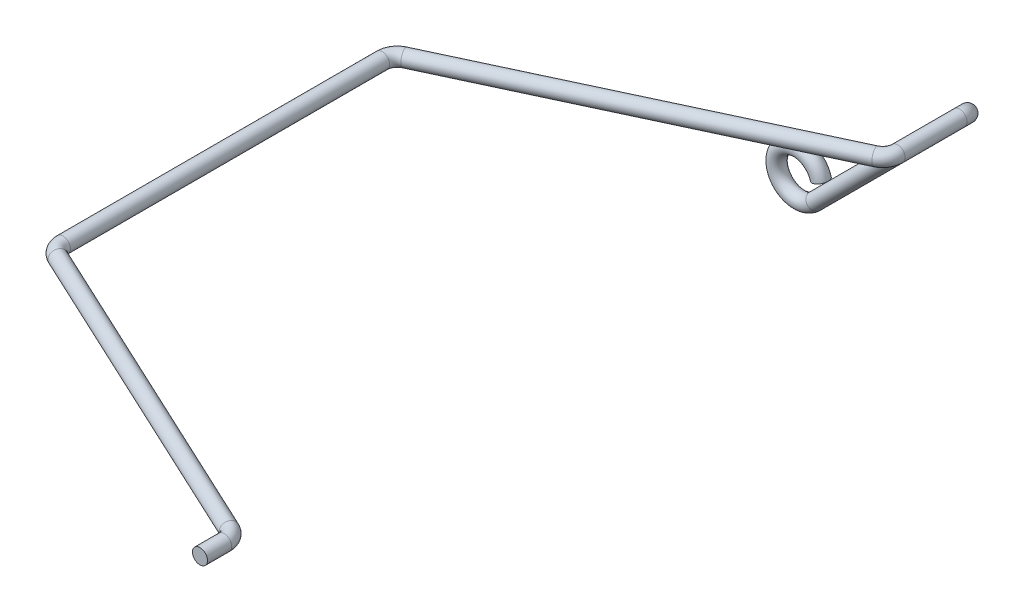
ISO-10303-21;
HEADER;
FILE_DESCRIPTION(('STEP AP214'),'2;1');
FILE_NAME('part.step','',(''),(''),'','','');
FILE_SCHEMA(('AUTOMOTIVE_DESIGN { 1 0 10303 214 1 1 1 1 }'));
ENDSEC;
DATA;
#1=APPLICATION_CONTEXT('core data for automotive mechanical design processes');
#2=APPLICATION_PROTOCOL_DEFINITION('international standard','automotive_design',2000,#1);
#3=PRODUCT_CONTEXT('',#1,'mechanical');
#4=PRODUCT('Part','Part','',(#3));
#5=PRODUCT_RELATED_PRODUCT_CATEGORY('part','',(#4));
#6=PRODUCT_DEFINITION_FORMATION('','',#4);
#7=PRODUCT_DEFINITION_CONTEXT('part definition',#1,'design');
#8=PRODUCT_DEFINITION('design','',#6,#7);
#9=PRODUCT_DEFINITION_SHAPE('','',#8);
#10=(LENGTH_UNIT() NAMED_UNIT(*) SI_UNIT(.MILLI.,.METRE.));
#11=(NAMED_UNIT(*) PLANE_ANGLE_UNIT() SI_UNIT($,.RADIAN.));
#12=(NAMED_UNIT(*) SI_UNIT($,.STERADIAN.) SOLID_ANGLE_UNIT());
#13=UNCERTAINTY_MEASURE_WITH_UNIT(LENGTH_MEASURE(1.E-05),#10,'distance_accuracy_value','');
#14=(GEOMETRIC_REPRESENTATION_CONTEXT(3) GLOBAL_UNCERTAINTY_ASSIGNED_CONTEXT((#13)) GLOBAL_UNIT_ASSIGNED_CONTEXT((#10,
#11,#12)) REPRESENTATION_CONTEXT('',''));
#15=CARTESIAN_POINT('',(0.,0.,0.));
#16=DIRECTION('',(0.,0.,1.));
#17=DIRECTION('',(1.,0.,0.));
#18=AXIS2_PLACEMENT_3D('',#15,#16,#17);
#19=CARTESIAN_POINT('',(-23.334523779156,-19.0918830920372,-103.));
#20=DIRECTION('',(0.,0.,1.));
#21=DIRECTION('',(-1.,0.,0.));
#22=AXIS2_PLACEMENT_3D('',#19,#20,#21);
#23=TOROIDAL_SURFACE('',#22,2.9999999999999,1.);
#24=CARTESIAN_POINT('',(-20.436746300289,-18.3154259567292,-103.));
#25=DIRECTION('',(-0.258819045102662,0.96592582628903,0.));
#26=DIRECTION('',(0.683012701892195,0.183012701892317,-0.707106781186546));
#27=AXIS2_PLACEMENT_3D('',#24,#25,#26);
#28=CIRCLE('',#27,1.);
#29=CARTESIAN_POINT('',(-19.470820474,-18.0566069116266,-103.));
#30=VERTEX_POINT('',#29);
#31=EDGE_CURVE('E10',#30,#30,#28,.T.);
#32=CARTESIAN_POINT('',(-21.2132034355965,-21.2132034355968,-103.));
#33=DIRECTION('',(0.707106781186561,0.707106781186534,0.));
#34=DIRECTION('',(0.49999999999999,-0.500000000000013,-0.707106781186546));
#35=AXIS2_PLACEMENT_3D('',#32,#33,#34);
#36=CIRCLE('',#35,1.);
#37=CARTESIAN_POINT('',(-20.50609665441,-21.9203102167833,-103.));
#38=VERTEX_POINT('',#37);
#39=EDGE_CURVE('E39',#38,#38,#36,.T.);
#40=CARTESIAN_POINT('',(-23.334523779156,-19.0918830920372,-103.));
#41=DIRECTION('',(0.,0.,1.));
#42=DIRECTION('',(-1.,0.,0.));
#43=AXIS2_PLACEMENT_3D('',#40,#41,#42);
#44=CIRCLE('',#43,3.9999999999999);
#45=EDGE_CURVE('',#30,#38,#44,.T.);
#46=ORIENTED_EDGE('',*,*,#31,.T.);
#47=ORIENTED_EDGE('',*,*,#39,.F.);
#48=ORIENTED_EDGE('',*,*,#45,.T.);
#49=ORIENTED_EDGE('',*,*,#45,.F.);
#50=EDGE_LOOP('',(#46,#48,#47,#49));
#51=FACE_BOUND('',#50,.T.);
#52=ADVANCED_FACE('F33',(#51),#23,.T.);
#53=CARTESIAN_POINT('',(-1.41421356237319,-1.41421356237305,-103.));
#54=DIRECTION('',(-0.70710678118654,-0.707106781186555,0.));
#55=DIRECTION('',(0.707106781186555,-0.70710678118654,0.));
#56=AXIS2_PLACEMENT_3D('',#53,#54,#55);
#57=CYLINDRICAL_SURFACE('',#56,1.);
#58=CARTESIAN_POINT('',(-1.41421356237319,-1.41421356237305,-103.));
#59=DIRECTION('',(0.707106781186561,0.707106781186534,0.));
#60=DIRECTION('',(0.49999999999999,-0.500000000000013,-0.707106781186546));
#61=AXIS2_PLACEMENT_3D('',#58,#59,#60);
#62=CIRCLE('',#61,1.);
#63=CARTESIAN_POINT('',(-1.41421356237319,-1.41421356237307,-104.));
#64=VERTEX_POINT('',#63);
#65=EDGE_CURVE('E43',#64,#64,#62,.T.);
#66=ORIENTED_EDGE('',*,*,#65,.F.);
#67=EDGE_LOOP('',(#66));
#68=FACE_BOUND('',#67,.T.);
#69=ORIENTED_EDGE('',*,*,#39,.T.);
#70=EDGE_LOOP('',(#69));
#71=FACE_BOUND('',#70,.T.);
#72=ADVANCED_FACE('F134',(#68,#71),#57,.T.);
#73=CARTESIAN_POINT('',(-1.41421356237318,-1.41421356237301,-101.));
#74=DIRECTION('',(0.707106781186544,-0.707106781186551,0.));
#75=DIRECTION('',(0.707106781186551,0.707106781186544,0.));
#76=AXIS2_PLACEMENT_3D('',#73,#74,#75);
#77=TOROIDAL_SURFACE('',#76,2.00000000000012,1.);
#78=CARTESIAN_POINT('',(0.,1.63658069083023E-13,-101.));
#79=DIRECTION('',(0.,0.,1.));
#80=DIRECTION('',(1.,0.,0.));
#81=AXIS2_PLACEMENT_3D('',#78,#79,#80);
#82=CIRCLE('',#81,1.);
#83=CARTESIAN_POINT('',(0.707106781186553,0.707106781186707,-101.));
#84=VERTEX_POINT('',#83);
#85=EDGE_CURVE('E47',#84,#84,#82,.T.);
#86=CARTESIAN_POINT('',(-1.41421356237318,-1.41421356237301,-101.));
#87=DIRECTION('',(0.707106781186544,-0.707106781186551,0.));
#88=DIRECTION('',(0.707106781186551,0.707106781186544,0.));
#89=AXIS2_PLACEMENT_3D('',#86,#87,#88);
#90=CIRCLE('',#89,3.00000000000012);
#91=EDGE_CURVE('',#64,#84,#90,.T.);
#92=ORIENTED_EDGE('',*,*,#65,.T.);
#93=ORIENTED_EDGE('',*,*,#85,.F.);
#94=ORIENTED_EDGE('',*,*,#91,.T.);
#95=ORIENTED_EDGE('',*,*,#91,.F.);
#96=EDGE_LOOP('',(#92,#94,#93,#95));
#97=FACE_BOUND('',#96,.T.);
#98=ADVANCED_FACE('F128',(#97),#77,.T.);
#99=CARTESIAN_POINT('',(0.,0.,-92.7737260476329));
#100=DIRECTION('',(0.,0.,-1.));
#101=DIRECTION('',(0.,-1.,0.));
#102=AXIS2_PLACEMENT_3D('',#99,#100,#101);
#103=CYLINDRICAL_SURFACE('',#102,1.);
#104=CARTESIAN_POINT('',(0.,0.,-92.7737260476329));
#105=DIRECTION('',(0.,0.,1.));
#106=DIRECTION('',(1.,0.,0.));
#107=AXIS2_PLACEMENT_3D('',#104,#105,#106);
#108=CIRCLE('',#107,1.);
#109=CARTESIAN_POINT('',(1.,0.,-92.7737260476329));
#110=VERTEX_POINT('',#109);
#111=EDGE_CURVE('E52',#110,#110,#108,.T.);
#112=ORIENTED_EDGE('',*,*,#111,.F.);
#113=EDGE_LOOP('',(#112));
#114=FACE_BOUND('',#113,.T.);
#115=ORIENTED_EDGE('',*,*,#85,.T.);
#116=EDGE_LOOP('',(#115));
#117=FACE_BOUND('',#116,.T.);
#118=ADVANCED_FACE('F122',(#114,#117),#103,.T.);
#119=CARTESIAN_POINT('',(-2.,0.,-92.7737260476329));
#120=DIRECTION('',(0.,-1.,0.));
#121=DIRECTION('',(0.,0.,1.));
#122=AXIS2_PLACEMENT_3D('',#119,#120,#121);
#123=TOROIDAL_SURFACE('',#122,2.,1.);
#124=CARTESIAN_POINT('',(-1.15422906933774,0.,-90.9613597676424));
#125=DIRECTION('',(-0.906183139995262,0.,0.422885465331132));
#126=DIRECTION('',(0.422885465331132,0.,0.906183139995262));
#127=AXIS2_PLACEMENT_3D('',#124,#125,#126);
#128=CIRCLE('',#127,1.);
#129=CARTESIAN_POINT('',(-0.731343604006615,0.,-90.0551766276471));
#130=VERTEX_POINT('',#129);
#131=EDGE_CURVE('E55',#130,#130,#128,.T.);
#132=CARTESIAN_POINT('',(-2.,0.,-92.7737260476329));
#133=DIRECTION('',(0.,-1.,0.));
#134=DIRECTION('',(0.,0.,1.));
#135=AXIS2_PLACEMENT_3D('',#132,#133,#134);
#136=CIRCLE('',#135,3.);
#137=EDGE_CURVE('',#110,#130,#136,.T.);
#138=ORIENTED_EDGE('',*,*,#111,.T.);
#139=ORIENTED_EDGE('',*,*,#131,.F.);
#140=ORIENTED_EDGE('',*,*,#137,.T.);
#141=ORIENTED_EDGE('',*,*,#137,.F.);
#142=EDGE_LOOP('',(#138,#140,#139,#141));
#143=FACE_BOUND('',#142,.T.);
#144=ADVANCED_FACE('F116',(#143),#123,.T.);
#145=CARTESIAN_POINT('',(-43.8457709306622,0.,-71.0386402323576));
#146=DIRECTION('',(0.906183139995265,0.,-0.422885465331124));
#147=DIRECTION('',(0.422885465331124,0.,0.906183139995265));
#148=AXIS2_PLACEMENT_3D('',#145,#146,#147);
#149=CYLINDRICAL_SURFACE('',#148,1.);
#150=CARTESIAN_POINT('',(-43.8457709306622,0.,-71.0386402323576));
#151=DIRECTION('',(-0.906183139995262,0.,0.422885465331132));
#152=DIRECTION('',(0.422885465331132,0.,0.906183139995262));
#153=AXIS2_PLACEMENT_3D('',#150,#151,#152);
#154=CIRCLE('',#153,1.);
#155=CARTESIAN_POINT('',(-44.2686563959934,0.,-71.9448233723529));
#156=VERTEX_POINT('',#155);
#157=EDGE_CURVE('E58',#156,#156,#154,.T.);
#158=ORIENTED_EDGE('',*,*,#157,.F.);
#159=EDGE_LOOP('',(#158));
#160=FACE_BOUND('',#159,.T.);
#161=ORIENTED_EDGE('',*,*,#131,.T.);
#162=EDGE_LOOP('',(#161));
#163=FACE_BOUND('',#162,.T.);
#164=ADVANCED_FACE('F110',(#160,#163),#149,.T.);
#165=CARTESIAN_POINT('',(-43.,0.,-69.2262739523671));
#166=DIRECTION('',(0.,1.,0.));
#167=DIRECTION('',(0.,0.,-1.));
#168=AXIS2_PLACEMENT_3D('',#165,#166,#167);
#169=TOROIDAL_SURFACE('',#168,2.00000000000001,1.);
#170=CARTESIAN_POINT('',(-45.,0.,-69.2262739523671));
#171=DIRECTION('',(0.,0.,1.));
#172=DIRECTION('',(1.,0.,0.));
#173=AXIS2_PLACEMENT_3D('',#170,#171,#172);
#174=CIRCLE('',#173,1.);
#175=CARTESIAN_POINT('',(-46.,0.,-69.2262739523671));
#176=VERTEX_POINT('',#175);
#177=EDGE_CURVE('E61',#176,#176,#174,.T.);
#178=CARTESIAN_POINT('',(-43.,0.,-69.2262739523671));
#179=DIRECTION('',(0.,1.,0.));
#180=DIRECTION('',(0.,0.,-1.));
#181=AXIS2_PLACEMENT_3D('',#178,#179,#180);
#182=CIRCLE('',#181,3.00000000000001);
#183=EDGE_CURVE('',#156,#176,#182,.T.);
#184=ORIENTED_EDGE('',*,*,#157,.T.);
#185=ORIENTED_EDGE('',*,*,#177,.F.);
#186=ORIENTED_EDGE('',*,*,#183,.T.);
#187=ORIENTED_EDGE('',*,*,#183,.F.);
#188=EDGE_LOOP('',(#184,#186,#185,#187));
#189=FACE_BOUND('',#188,.T.);
#190=ADVANCED_FACE('F104',(#189),#169,.T.);
#191=CARTESIAN_POINT('',(-45.,0.,-26.7737260476329));
#192=DIRECTION('',(0.,0.,-1.));
#193=DIRECTION('',(1.,0.,0.));
#194=AXIS2_PLACEMENT_3D('',#191,#192,#193);
#195=CYLINDRICAL_SURFACE('',#194,1.);
#196=CARTESIAN_POINT('',(-45.,0.,-26.7737260476329));
#197=DIRECTION('',(0.,0.,1.));
#198=DIRECTION('',(1.,0.,0.));
#199=AXIS2_PLACEMENT_3D('',#196,#197,#198);
#200=CIRCLE('',#199,1.);
#201=CARTESIAN_POINT('',(-46.,0.,-26.7737260476329));
#202=VERTEX_POINT('',#201);
#203=EDGE_CURVE('E64',#202,#202,#200,.T.);
#204=ORIENTED_EDGE('',*,*,#203,.F.);
#205=EDGE_LOOP('',(#204));
#206=FACE_BOUND('',#205,.T.);
#207=ORIENTED_EDGE('',*,*,#177,.T.);
#208=EDGE_LOOP('',(#207));
#209=FACE_BOUND('',#208,.T.);
#210=ADVANCED_FACE('F98',(#206,#209),#195,.T.);
#211=CARTESIAN_POINT('',(-43.,0.,-26.7737260476329));
#212=DIRECTION('',(0.,1.,0.));
#213=DIRECTION('',(0.,0.,-1.));
#214=AXIS2_PLACEMENT_3D('',#211,#212,#213);
#215=TOROIDAL_SURFACE('',#214,2.,1.);
#216=CARTESIAN_POINT('',(-43.8457709306623,0.,-24.9613597676424));
#217=DIRECTION('',(0.906183139995265,0.,0.422885465331124));
#218=DIRECTION('',(0.422885465331124,0.,-0.906183139995265));
#219=AXIS2_PLACEMENT_3D('',#216,#217,#218);
#220=CIRCLE('',#219,1.);
#221=CARTESIAN_POINT('',(-44.2686563959934,0.,-24.0551766276471));
#222=VERTEX_POINT('',#221);
#223=EDGE_CURVE('E67',#222,#222,#220,.T.);
#224=CARTESIAN_POINT('',(-43.,0.,-26.7737260476329));
#225=DIRECTION('',(0.,1.,0.));
#226=DIRECTION('',(0.,0.,-1.));
#227=AXIS2_PLACEMENT_3D('',#224,#225,#226);
#228=CIRCLE('',#227,3.);
#229=EDGE_CURVE('',#202,#222,#228,.T.);
#230=ORIENTED_EDGE('',*,*,#203,.T.);
#231=ORIENTED_EDGE('',*,*,#223,.F.);
#232=ORIENTED_EDGE('',*,*,#229,.T.);
#233=ORIENTED_EDGE('',*,*,#229,.F.);
#234=EDGE_LOOP('',(#230,#232,#231,#233));
#235=FACE_BOUND('',#234,.T.);
#236=ADVANCED_FACE('F92',(#235),#215,.T.);
#237=CARTESIAN_POINT('',(-1.15422906933775,0.,-5.03864023235763));
#238=DIRECTION('',(-0.906183139995266,0.,-0.422885465331124));
#239=DIRECTION('',(0.422885465331124,0.,-0.906183139995266));
#240=AXIS2_PLACEMENT_3D('',#237,#238,#239);
#241=CYLINDRICAL_SURFACE('',#240,1.);
#242=CARTESIAN_POINT('',(-1.15422906933775,0.,-5.03864023235763));
#243=DIRECTION('',(0.906183139995265,0.,0.422885465331124));
#244=DIRECTION('',(0.422885465331124,0.,-0.906183139995265));
#245=AXIS2_PLACEMENT_3D('',#242,#243,#244);
#246=CIRCLE('',#245,1.);
#247=CARTESIAN_POINT('',(-0.731343604006628,0.,-5.9448233723529));
#248=VERTEX_POINT('',#247);
#249=EDGE_CURVE('E70',#248,#248,#246,.T.);
#250=ORIENTED_EDGE('',*,*,#249,.F.);
#251=EDGE_LOOP('',(#250));
#252=FACE_BOUND('',#251,.T.);
#253=ORIENTED_EDGE('',*,*,#223,.T.);
#254=EDGE_LOOP('',(#253));
#255=FACE_BOUND('',#254,.T.);
#256=ADVANCED_FACE('F86',(#252,#255),#241,.T.);
#257=CARTESIAN_POINT('',(-2.,0.,-3.2262739523671));
#258=DIRECTION('',(0.,-1.,0.));
#259=DIRECTION('',(0.,0.,1.));
#260=AXIS2_PLACEMENT_3D('',#257,#258,#259);
#261=TOROIDAL_SURFACE('',#260,2.,1.);
#262=CARTESIAN_POINT('',(0.,0.,-3.2262739523671));
#263=DIRECTION('',(0.,0.,1.));
#264=DIRECTION('',(1.,0.,0.));
#265=AXIS2_PLACEMENT_3D('',#262,#263,#264);
#266=CIRCLE('',#265,1.);
#267=CARTESIAN_POINT('',(1.,0.,-3.2262739523671));
#268=VERTEX_POINT('',#267);
#269=EDGE_CURVE('E73',#268,#268,#266,.T.);
#270=CARTESIAN_POINT('',(-2.,0.,-3.2262739523671));
#271=DIRECTION('',(0.,-1.,0.));
#272=DIRECTION('',(0.,0.,1.));
#273=AXIS2_PLACEMENT_3D('',#270,#271,#272);
#274=CIRCLE('',#273,3.);
#275=EDGE_CURVE('',#248,#268,#274,.T.);
#276=ORIENTED_EDGE('',*,*,#249,.T.);
#277=ORIENTED_EDGE('',*,*,#269,.F.);
#278=ORIENTED_EDGE('',*,*,#275,.T.);
#279=ORIENTED_EDGE('',*,*,#275,.F.);
#280=EDGE_LOOP('',(#276,#278,#277,#279));
#281=FACE_BOUND('',#280,.T.);
#282=ADVANCED_FACE('F83',(#281),#261,.T.);
#283=CARTESIAN_POINT('',(0.,0.,-3.2262739523671));
#284=DIRECTION('',(0.,0.,1.));
#285=DIRECTION('',(0.,1.,0.));
#286=AXIS2_PLACEMENT_3D('',#283,#284,#285);
#287=CYLINDRICAL_SURFACE('',#286,1.);
#288=ORIENTED_EDGE('',*,*,#269,.T.);
#289=EDGE_LOOP('',(#288));
#290=FACE_BOUND('',#289,.T.);
#291=CARTESIAN_POINT('',(0.,0.,0.));
#292=DIRECTION('',(0.,0.,1.));
#293=DIRECTION('',(1.,0.,0.));
#294=AXIS2_PLACEMENT_3D('',#291,#292,#293);
#295=CIRCLE('',#294,1.);
#296=CARTESIAN_POINT('',(1.,0.,0.));
#297=VERTEX_POINT('',#296);
#298=EDGE_CURVE('E74',#297,#297,#295,.T.);
#299=ORIENTED_EDGE('',*,*,#298,.F.);
#300=EDGE_LOOP('',(#299));
#301=FACE_BOUND('',#300,.T.);
#302=ADVANCED_FACE('F80',(#290,#301),#287,.T.);
#303=CARTESIAN_POINT('',(-20.436746300289,-18.3154259567292,-103.));
#304=DIRECTION('',(0.258819045102662,-0.96592582628903,0.));
#305=DIRECTION('',(0.683012701892195,0.183012701892317,-0.707106781186546));
#306=AXIS2_PLACEMENT_3D('',#303,#304,#305);
#307=PLANE('',#306);
#308=ORIENTED_EDGE('',*,*,#31,.F.);
#309=EDGE_LOOP('',(#308));
#310=FACE_BOUND('',#309,.T.);
#311=ADVANCED_FACE('F146',(#310),#307,.T.);
#312=CARTESIAN_POINT('',(0.,0.,0.));
#313=DIRECTION('',(0.,0.,-1.));
#314=DIRECTION('',(1.,0.,0.));
#315=AXIS2_PLACEMENT_3D('',#312,#313,#314);
#316=PLANE('',#315);
#317=ORIENTED_EDGE('',*,*,#298,.T.);
#318=EDGE_LOOP('',(#317));
#319=FACE_BOUND('',#318,.T.);
#320=ADVANCED_FACE('F147',(#319),#316,.F.);
#321=CLOSED_SHELL('',(#52,#72,#98,#118,#144,#164,#190,#210,#236,#256,#282,#302,#311,#320));
#322=MANIFOLD_SOLID_BREP('B2',#321);
#323=ADVANCED_BREP_SHAPE_REPRESENTATION('',(#18,#322),#14);
#324=SHAPE_DEFINITION_REPRESENTATION(#9,#323);
ENDSEC;
END-ISO-10303-21;
